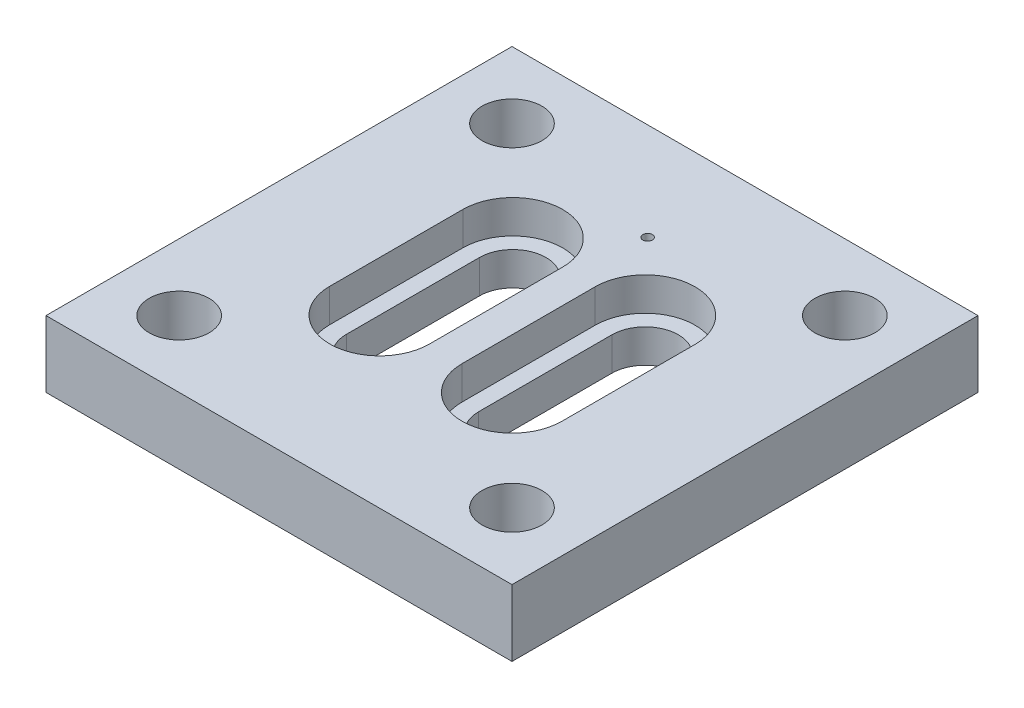
ISO-10303-21;
HEADER;
FILE_DESCRIPTION(('STEP AP214'),'2;1');
FILE_NAME('part.step','',(''),(''),'','','');
FILE_SCHEMA(('AUTOMOTIVE_DESIGN { 1 0 10303 214 1 1 1 1 }'));
ENDSEC;
DATA;
#1=APPLICATION_CONTEXT('core data for automotive mechanical design processes');
#2=APPLICATION_PROTOCOL_DEFINITION('international standard','automotive_design',2000,#1);
#3=PRODUCT_CONTEXT('',#1,'mechanical');
#4=PRODUCT('Part','Part','',(#3));
#5=PRODUCT_RELATED_PRODUCT_CATEGORY('part','',(#4));
#6=PRODUCT_DEFINITION_FORMATION('','',#4);
#7=PRODUCT_DEFINITION_CONTEXT('part definition',#1,'design');
#8=PRODUCT_DEFINITION('design','',#6,#7);
#9=PRODUCT_DEFINITION_SHAPE('','',#8);
#10=(LENGTH_UNIT() NAMED_UNIT(*) SI_UNIT(.MILLI.,.METRE.));
#11=(NAMED_UNIT(*) PLANE_ANGLE_UNIT() SI_UNIT($,.RADIAN.));
#12=(NAMED_UNIT(*) SI_UNIT($,.STERADIAN.) SOLID_ANGLE_UNIT());
#13=UNCERTAINTY_MEASURE_WITH_UNIT(LENGTH_MEASURE(1.E-05),#10,'distance_accuracy_value','');
#14=(GEOMETRIC_REPRESENTATION_CONTEXT(3) GLOBAL_UNCERTAINTY_ASSIGNED_CONTEXT((#13)) GLOBAL_UNIT_ASSIGNED_CONTEXT((#10,
#11,#12)) REPRESENTATION_CONTEXT('',''));
#15=CARTESIAN_POINT('',(0.,0.,0.));
#16=DIRECTION('',(0.,0.,1.));
#17=DIRECTION('',(1.,0.,0.));
#18=AXIS2_PLACEMENT_3D('',#15,#16,#17);
#19=CARTESIAN_POINT('',(70.,-20.,-70.));
#20=DIRECTION('',(1.,0.,0.));
#21=DIRECTION('',(0.,0.,-1.));
#22=AXIS2_PLACEMENT_3D('',#19,#20,#21);
#23=PLANE('',#22);
#24=DIRECTION('',(0.,0.,-1.));
#25=VECTOR('',#24,1.);
#26=CARTESIAN_POINT('',(70.,0.,-70.));
#27=LINE('',#26,#25);
#28=CARTESIAN_POINT('',(70.,0.,70.));
#29=VERTEX_POINT('',#28);
#30=CARTESIAN_POINT('',(70.,0.,-70.));
#31=VERTEX_POINT('',#30);
#32=EDGE_CURVE('E326',#29,#31,#27,.T.);
#33=ORIENTED_EDGE('',*,*,#32,.F.);
#34=DIRECTION('',(0.,1.,0.));
#35=VECTOR('',#34,1.);
#36=CARTESIAN_POINT('',(70.,-20.,70.));
#37=LINE('',#36,#35);
#38=CARTESIAN_POINT('',(70.,-20.,70.));
#39=VERTEX_POINT('',#38);
#40=EDGE_CURVE('E11',#39,#29,#37,.T.);
#41=ORIENTED_EDGE('',*,*,#40,.F.);
#42=DIRECTION('',(0.,0.,-1.));
#43=VECTOR('',#42,1.);
#44=CARTESIAN_POINT('',(70.,-20.,-70.));
#45=LINE('',#44,#43);
#46=CARTESIAN_POINT('',(70.,-20.,-70.));
#47=VERTEX_POINT('',#46);
#48=EDGE_CURVE('E329',#39,#47,#45,.T.);
#49=ORIENTED_EDGE('',*,*,#48,.T.);
#50=DIRECTION('',(0.,1.,0.));
#51=VECTOR('',#50,1.);
#52=CARTESIAN_POINT('',(70.,-20.,-70.));
#53=LINE('',#52,#51);
#54=EDGE_CURVE('E38',#47,#31,#53,.T.);
#55=ORIENTED_EDGE('',*,*,#54,.T.);
#56=EDGE_LOOP('',(#33,#41,#49,#55));
#57=FACE_BOUND('',#56,.T.);
#58=ADVANCED_FACE('F35',(#57),#23,.T.);
#59=CARTESIAN_POINT('',(-70.,-20.,70.));
#60=DIRECTION('',(0.,0.,1.));
#61=DIRECTION('',(1.,0.,0.));
#62=AXIS2_PLACEMENT_3D('',#59,#60,#61);
#63=PLANE('',#62);
#64=DIRECTION('',(1.,0.,0.));
#65=VECTOR('',#64,1.);
#66=CARTESIAN_POINT('',(-70.,0.,70.));
#67=LINE('',#66,#65);
#68=CARTESIAN_POINT('',(-70.,0.,70.));
#69=VERTEX_POINT('',#68);
#70=EDGE_CURVE('E333',#69,#29,#67,.T.);
#71=ORIENTED_EDGE('',*,*,#70,.F.);
#72=DIRECTION('',(0.,1.,0.));
#73=VECTOR('',#72,1.);
#74=CARTESIAN_POINT('',(-70.,-20.,70.));
#75=LINE('',#74,#73);
#76=CARTESIAN_POINT('',(-70.,-20.,70.));
#77=VERTEX_POINT('',#76);
#78=EDGE_CURVE('E43',#77,#69,#75,.T.);
#79=ORIENTED_EDGE('',*,*,#78,.F.);
#80=DIRECTION('',(1.,0.,0.));
#81=VECTOR('',#80,1.);
#82=CARTESIAN_POINT('',(-70.,-20.,70.));
#83=LINE('',#82,#81);
#84=EDGE_CURVE('E339',#77,#39,#83,.T.);
#85=ORIENTED_EDGE('',*,*,#84,.T.);
#86=ORIENTED_EDGE('',*,*,#40,.T.);
#87=EDGE_LOOP('',(#71,#79,#85,#86));
#88=FACE_BOUND('',#87,.T.);
#89=ADVANCED_FACE('F365',(#88),#63,.T.);
#90=CARTESIAN_POINT('',(-70.,-20.,-70.));
#91=DIRECTION('',(-1.,0.,0.));
#92=DIRECTION('',(0.,0.,1.));
#93=AXIS2_PLACEMENT_3D('',#90,#91,#92);
#94=PLANE('',#93);
#95=DIRECTION('',(0.,0.,1.));
#96=VECTOR('',#95,1.);
#97=CARTESIAN_POINT('',(-70.,0.,-70.));
#98=LINE('',#97,#96);
#99=CARTESIAN_POINT('',(-70.,0.,-70.));
#100=VERTEX_POINT('',#99);
#101=EDGE_CURVE('E347',#100,#69,#98,.T.);
#102=ORIENTED_EDGE('',*,*,#101,.F.);
#103=DIRECTION('',(0.,1.,0.));
#104=VECTOR('',#103,1.);
#105=CARTESIAN_POINT('',(-70.,-20.,-70.));
#106=LINE('',#105,#104);
#107=CARTESIAN_POINT('',(-70.,-20.,-70.));
#108=VERTEX_POINT('',#107);
#109=EDGE_CURVE('E352',#108,#100,#106,.T.);
#110=ORIENTED_EDGE('',*,*,#109,.F.);
#111=DIRECTION('',(0.,0.,1.));
#112=VECTOR('',#111,1.);
#113=CARTESIAN_POINT('',(-70.,-20.,-70.));
#114=LINE('',#113,#112);
#115=EDGE_CURVE('E336',#108,#77,#114,.T.);
#116=ORIENTED_EDGE('',*,*,#115,.T.);
#117=ORIENTED_EDGE('',*,*,#78,.T.);
#118=EDGE_LOOP('',(#102,#110,#116,#117));
#119=FACE_BOUND('',#118,.T.);
#120=ADVANCED_FACE('F370',(#119),#94,.T.);
#121=CARTESIAN_POINT('',(-70.,-20.,-70.));
#122=DIRECTION('',(0.,0.,-1.));
#123=DIRECTION('',(-1.,0.,0.));
#124=AXIS2_PLACEMENT_3D('',#121,#122,#123);
#125=PLANE('',#124);
#126=DIRECTION('',(-1.,0.,0.));
#127=VECTOR('',#126,1.);
#128=CARTESIAN_POINT('',(-70.,0.,-70.));
#129=LINE('',#128,#127);
#130=EDGE_CURVE('E344',#31,#100,#129,.T.);
#131=ORIENTED_EDGE('',*,*,#130,.F.);
#132=ORIENTED_EDGE('',*,*,#54,.F.);
#133=DIRECTION('',(-1.,0.,0.));
#134=VECTOR('',#133,1.);
#135=CARTESIAN_POINT('',(-70.,-20.,-70.));
#136=LINE('',#135,#134);
#137=EDGE_CURVE('E332',#47,#108,#136,.T.);
#138=ORIENTED_EDGE('',*,*,#137,.T.);
#139=ORIENTED_EDGE('',*,*,#109,.T.);
#140=EDGE_LOOP('',(#131,#132,#138,#139));
#141=FACE_BOUND('',#140,.T.);
#142=ADVANCED_FACE('F360',(#141),#125,.T.);
#143=CARTESIAN_POINT('',(0.,-20.,0.));
#144=DIRECTION('',(0.,1.,0.));
#145=DIRECTION('',(0.,0.,1.));
#146=AXIS2_PLACEMENT_3D('',#143,#144,#145);
#147=PLANE('',#146);
#148=CARTESIAN_POINT('',(0.,-20.,-40.7308031540772));
#149=DIRECTION('',(0.,1.,0.));
#150=DIRECTION('',(0.,0.,1.));
#151=AXIS2_PLACEMENT_3D('',#148,#149,#150);
#152=CIRCLE('',#151,2.3876);
#153=CARTESIAN_POINT('',(0.,-20.,-38.3432031540772));
#154=VERTEX_POINT('',#153);
#155=EDGE_CURVE('E659',#154,#154,#152,.T.);
#156=ORIENTED_EDGE('',*,*,#155,.T.);
#157=EDGE_LOOP('',(#156));
#158=FACE_BOUND('',#157,.T.);
#159=DIRECTION('',(0.,0.,1.));
#160=VECTOR('',#159,1.);
#161=CARTESIAN_POINT('',(30.,-20.,-20.));
#162=LINE('',#161,#160);
#163=CARTESIAN_POINT('',(30.,-20.,-20.));
#164=VERTEX_POINT('',#163);
#165=CARTESIAN_POINT('',(30.,-20.,20.));
#166=VERTEX_POINT('',#165);
#167=EDGE_CURVE('E189',#164,#166,#162,.T.);
#168=ORIENTED_EDGE('',*,*,#167,.F.);
#169=CARTESIAN_POINT('',(20.,-20.,-20.));
#170=DIRECTION('',(0.,-1.,0.));
#171=DIRECTION('',(0.,0.,-1.));
#172=AXIS2_PLACEMENT_3D('',#169,#170,#171);
#173=CIRCLE('',#172,10.);
#174=CARTESIAN_POINT('',(10.,-20.,-20.));
#175=VERTEX_POINT('',#174);
#176=EDGE_CURVE('E51',#175,#164,#173,.T.);
#177=ORIENTED_EDGE('',*,*,#176,.F.);
#178=DIRECTION('',(0.,0.,-1.));
#179=VECTOR('',#178,1.);
#180=CARTESIAN_POINT('',(10.,-20.,-20.));
#181=LINE('',#180,#179);
#182=CARTESIAN_POINT('',(10.,-20.,20.));
#183=VERTEX_POINT('',#182);
#184=EDGE_CURVE('E196',#183,#175,#181,.T.);
#185=ORIENTED_EDGE('',*,*,#184,.F.);
#186=CARTESIAN_POINT('',(20.,-20.,20.));
#187=DIRECTION('',(0.,-1.,0.));
#188=DIRECTION('',(0.,0.,-1.));
#189=AXIS2_PLACEMENT_3D('',#186,#187,#188);
#190=CIRCLE('',#189,10.);
#191=EDGE_CURVE('E179',#166,#183,#190,.T.);
#192=ORIENTED_EDGE('',*,*,#191,.F.);
#193=EDGE_LOOP('',(#168,#177,#185,#192));
#194=FACE_BOUND('',#193,.T.);
#195=DIRECTION('',(0.,0.,1.));
#196=VECTOR('',#195,1.);
#197=CARTESIAN_POINT('',(-10.,-20.,-20.2271705929049));
#198=LINE('',#197,#196);
#199=CARTESIAN_POINT('',(-10.,-20.,-20.2271705929049));
#200=VERTEX_POINT('',#199);
#201=CARTESIAN_POINT('',(-10.,-20.,19.7728294070951));
#202=VERTEX_POINT('',#201);
#203=EDGE_CURVE('E206',#200,#202,#198,.T.);
#204=ORIENTED_EDGE('',*,*,#203,.F.);
#205=CARTESIAN_POINT('',(-20.,-20.,-20.2271705929049));
#206=DIRECTION('',(0.,-1.,0.));
#207=DIRECTION('',(0.,0.,-1.));
#208=AXIS2_PLACEMENT_3D('',#205,#206,#207);
#209=CIRCLE('',#208,10.);
#210=CARTESIAN_POINT('',(-30.,-20.,-20.2271705929049));
#211=VERTEX_POINT('',#210);
#212=EDGE_CURVE('E59',#211,#200,#209,.T.);
#213=ORIENTED_EDGE('',*,*,#212,.F.);
#214=DIRECTION('',(0.,0.,-1.));
#215=VECTOR('',#214,1.);
#216=CARTESIAN_POINT('',(-30.,-20.,-20.2271705929049));
#217=LINE('',#216,#215);
#218=CARTESIAN_POINT('',(-30.,-20.,19.7728294070951));
#219=VERTEX_POINT('',#218);
#220=EDGE_CURVE('E213',#219,#211,#217,.T.);
#221=ORIENTED_EDGE('',*,*,#220,.F.);
#222=CARTESIAN_POINT('',(-20.,-20.,19.7728294070951));
#223=DIRECTION('',(0.,-1.,0.));
#224=DIRECTION('',(0.,0.,-1.));
#225=AXIS2_PLACEMENT_3D('',#222,#223,#224);
#226=CIRCLE('',#225,10.);
#227=EDGE_CURVE('E210',#202,#219,#226,.T.);
#228=ORIENTED_EDGE('',*,*,#227,.F.);
#229=EDGE_LOOP('',(#204,#213,#221,#228));
#230=FACE_BOUND('',#229,.T.);
#231=CARTESIAN_POINT('',(50.,-20.,50.));
#232=DIRECTION('',(0.,1.,0.));
#233=DIRECTION('',(0.,0.,1.));
#234=AXIS2_PLACEMENT_3D('',#231,#232,#233);
#235=CIRCLE('',#234,9.);
#236=CARTESIAN_POINT('',(50.,-20.,59.));
#237=VERTEX_POINT('',#236);
#238=EDGE_CURVE('E305',#237,#237,#235,.T.);
#239=ORIENTED_EDGE('',*,*,#238,.T.);
#240=EDGE_LOOP('',(#239));
#241=FACE_BOUND('',#240,.T.);
#242=CARTESIAN_POINT('',(-50.,-20.,50.));
#243=DIRECTION('',(0.,1.,0.));
#244=DIRECTION('',(0.,0.,1.));
#245=AXIS2_PLACEMENT_3D('',#242,#243,#244);
#246=CIRCLE('',#245,9.);
#247=CARTESIAN_POINT('',(-50.,-20.,59.));
#248=VERTEX_POINT('',#247);
#249=EDGE_CURVE('E311',#248,#248,#246,.T.);
#250=ORIENTED_EDGE('',*,*,#249,.T.);
#251=EDGE_LOOP('',(#250));
#252=FACE_BOUND('',#251,.T.);
#253=CARTESIAN_POINT('',(50.,-20.,-50.));
#254=DIRECTION('',(0.,1.,0.));
#255=DIRECTION('',(0.,0.,1.));
#256=AXIS2_PLACEMENT_3D('',#253,#254,#255);
#257=CIRCLE('',#256,9.);
#258=CARTESIAN_POINT('',(50.,-20.,-41.));
#259=VERTEX_POINT('',#258);
#260=EDGE_CURVE('E317',#259,#259,#257,.T.);
#261=ORIENTED_EDGE('',*,*,#260,.T.);
#262=EDGE_LOOP('',(#261));
#263=FACE_BOUND('',#262,.T.);
#264=CARTESIAN_POINT('',(-50.,-20.,-50.));
#265=DIRECTION('',(0.,1.,0.));
#266=DIRECTION('',(0.,0.,1.));
#267=AXIS2_PLACEMENT_3D('',#264,#265,#266);
#268=CIRCLE('',#267,9.);
#269=CARTESIAN_POINT('',(-50.,-20.,-41.));
#270=VERTEX_POINT('',#269);
#271=EDGE_CURVE('E323',#270,#270,#268,.T.);
#272=ORIENTED_EDGE('',*,*,#271,.T.);
#273=EDGE_LOOP('',(#272));
#274=FACE_BOUND('',#273,.T.);
#275=ORIENTED_EDGE('',*,*,#48,.F.);
#276=ORIENTED_EDGE('',*,*,#84,.F.);
#277=ORIENTED_EDGE('',*,*,#115,.F.);
#278=ORIENTED_EDGE('',*,*,#137,.F.);
#279=EDGE_LOOP('',(#275,#276,#277,#278));
#280=FACE_BOUND('',#279,.T.);
#281=ADVANCED_FACE('F193',(#158,#194,#230,#241,#252,#263,#274,#280),#147,.F.);
#282=CARTESIAN_POINT('',(0.,0.,0.));
#283=DIRECTION('',(0.,1.,0.));
#284=DIRECTION('',(0.,0.,1.));
#285=AXIS2_PLACEMENT_3D('',#282,#283,#284);
#286=PLANE('',#285);
#287=CARTESIAN_POINT('',(0.,0.,-40.7308031540772));
#288=DIRECTION('',(0.,1.,0.));
#289=DIRECTION('',(0.,0.,1.));
#290=AXIS2_PLACEMENT_3D('',#287,#288,#289);
#291=CIRCLE('',#290,1.4351);
#292=CARTESIAN_POINT('',(0.,0.,-39.2957031540772));
#293=VERTEX_POINT('',#292);
#294=EDGE_CURVE('E658',#293,#293,#291,.T.);
#295=ORIENTED_EDGE('',*,*,#294,.F.);
#296=EDGE_LOOP('',(#295));
#297=FACE_BOUND('',#296,.T.);
#298=CARTESIAN_POINT('',(-20.,0.,19.7728294070951));
#299=DIRECTION('',(0.,1.,0.));
#300=DIRECTION('',(0.,0.,1.));
#301=AXIS2_PLACEMENT_3D('',#298,#299,#300);
#302=CIRCLE('',#301,15.);
#303=CARTESIAN_POINT('',(-35.,0.,19.7728294070951));
#304=VERTEX_POINT('',#303);
#305=CARTESIAN_POINT('',(-5.00000000000001,0.,19.7728294070951));
#306=VERTEX_POINT('',#305);
#307=EDGE_CURVE('E234',#304,#306,#302,.T.);
#308=ORIENTED_EDGE('',*,*,#307,.F.);
#309=DIRECTION('',(0.,0.,1.));
#310=VECTOR('',#309,1.);
#311=CARTESIAN_POINT('',(-35.,0.,-20.2271705929049));
#312=LINE('',#311,#310);
#313=CARTESIAN_POINT('',(-35.,0.,-20.2271705929049));
#314=VERTEX_POINT('',#313);
#315=EDGE_CURVE('E239',#314,#304,#312,.T.);
#316=ORIENTED_EDGE('',*,*,#315,.F.);
#317=CARTESIAN_POINT('',(-20.,0.,-20.2271705929049));
#318=DIRECTION('',(0.,1.,0.));
#319=DIRECTION('',(0.,0.,1.));
#320=AXIS2_PLACEMENT_3D('',#317,#318,#319);
#321=CIRCLE('',#320,15.);
#322=CARTESIAN_POINT('',(-5.,0.,-20.2271705929049));
#323=VERTEX_POINT('',#322);
#324=EDGE_CURVE('E253',#323,#314,#321,.T.);
#325=ORIENTED_EDGE('',*,*,#324,.F.);
#326=DIRECTION('',(0.,0.,-1.));
#327=VECTOR('',#326,1.);
#328=CARTESIAN_POINT('',(-5.00000000000001,0.,-20.2271705929049));
#329=LINE('',#328,#327);
#330=EDGE_CURVE('E250',#306,#323,#329,.T.);
#331=ORIENTED_EDGE('',*,*,#330,.F.);
#332=EDGE_LOOP('',(#308,#316,#325,#331));
#333=FACE_BOUND('',#332,.T.);
#334=CARTESIAN_POINT('',(20.,0.,20.));
#335=DIRECTION('',(0.,1.,0.));
#336=DIRECTION('',(0.,0.,1.));
#337=AXIS2_PLACEMENT_3D('',#334,#335,#336);
#338=CIRCLE('',#337,15.);
#339=CARTESIAN_POINT('',(5.,0.,20.));
#340=VERTEX_POINT('',#339);
#341=CARTESIAN_POINT('',(35.,0.,20.));
#342=VERTEX_POINT('',#341);
#343=EDGE_CURVE('E274',#340,#342,#338,.T.);
#344=ORIENTED_EDGE('',*,*,#343,.F.);
#345=DIRECTION('',(0.,0.,1.));
#346=VECTOR('',#345,1.);
#347=CARTESIAN_POINT('',(5.,0.,-20.));
#348=LINE('',#347,#346);
#349=CARTESIAN_POINT('',(5.,0.,-20.));
#350=VERTEX_POINT('',#349);
#351=EDGE_CURVE('E279',#350,#340,#348,.T.);
#352=ORIENTED_EDGE('',*,*,#351,.F.);
#353=CARTESIAN_POINT('',(20.,0.,-20.));
#354=DIRECTION('',(0.,1.,0.));
#355=DIRECTION('',(0.,0.,1.));
#356=AXIS2_PLACEMENT_3D('',#353,#354,#355);
#357=CIRCLE('',#356,15.);
#358=CARTESIAN_POINT('',(35.,0.,-20.));
#359=VERTEX_POINT('',#358);
#360=EDGE_CURVE('E293',#359,#350,#357,.T.);
#361=ORIENTED_EDGE('',*,*,#360,.F.);
#362=DIRECTION('',(0.,0.,-1.));
#363=VECTOR('',#362,1.);
#364=CARTESIAN_POINT('',(35.,0.,-20.));
#365=LINE('',#364,#363);
#366=EDGE_CURVE('E290',#342,#359,#365,.T.);
#367=ORIENTED_EDGE('',*,*,#366,.F.);
#368=EDGE_LOOP('',(#344,#352,#361,#367));
#369=FACE_BOUND('',#368,.T.);
#370=CARTESIAN_POINT('',(50.,0.,50.));
#371=DIRECTION('',(0.,1.,0.));
#372=DIRECTION('',(0.,0.,1.));
#373=AXIS2_PLACEMENT_3D('',#370,#371,#372);
#374=CIRCLE('',#373,9.);
#375=CARTESIAN_POINT('',(50.,0.,59.));
#376=VERTEX_POINT('',#375);
#377=EDGE_CURVE('E260',#376,#376,#374,.T.);
#378=ORIENTED_EDGE('',*,*,#377,.F.);
#379=EDGE_LOOP('',(#378));
#380=FACE_BOUND('',#379,.T.);
#381=CARTESIAN_POINT('',(-50.,0.,50.));
#382=DIRECTION('',(0.,1.,0.));
#383=DIRECTION('',(0.,0.,1.));
#384=AXIS2_PLACEMENT_3D('',#381,#382,#383);
#385=CIRCLE('',#384,9.);
#386=CARTESIAN_POINT('',(-50.,0.,59.));
#387=VERTEX_POINT('',#386);
#388=EDGE_CURVE('E308',#387,#387,#385,.T.);
#389=ORIENTED_EDGE('',*,*,#388,.F.);
#390=EDGE_LOOP('',(#389));
#391=FACE_BOUND('',#390,.T.);
#392=CARTESIAN_POINT('',(50.,0.,-50.));
#393=DIRECTION('',(0.,1.,0.));
#394=DIRECTION('',(0.,0.,1.));
#395=AXIS2_PLACEMENT_3D('',#392,#393,#394);
#396=CIRCLE('',#395,9.);
#397=CARTESIAN_POINT('',(50.,0.,-41.));
#398=VERTEX_POINT('',#397);
#399=EDGE_CURVE('E314',#398,#398,#396,.T.);
#400=ORIENTED_EDGE('',*,*,#399,.F.);
#401=EDGE_LOOP('',(#400));
#402=FACE_BOUND('',#401,.T.);
#403=CARTESIAN_POINT('',(-50.,0.,-50.));
#404=DIRECTION('',(0.,1.,0.));
#405=DIRECTION('',(0.,0.,1.));
#406=AXIS2_PLACEMENT_3D('',#403,#404,#405);
#407=CIRCLE('',#406,9.);
#408=CARTESIAN_POINT('',(-50.,0.,-41.));
#409=VERTEX_POINT('',#408);
#410=EDGE_CURVE('E320',#409,#409,#407,.T.);
#411=ORIENTED_EDGE('',*,*,#410,.F.);
#412=EDGE_LOOP('',(#411));
#413=FACE_BOUND('',#412,.T.);
#414=ORIENTED_EDGE('',*,*,#32,.T.);
#415=ORIENTED_EDGE('',*,*,#130,.T.);
#416=ORIENTED_EDGE('',*,*,#101,.T.);
#417=ORIENTED_EDGE('',*,*,#70,.T.);
#418=EDGE_LOOP('',(#414,#415,#416,#417));
#419=FACE_BOUND('',#418,.T.);
#420=ADVANCED_FACE('F362',(#297,#333,#369,#380,#391,#402,#413,#419),#286,.T.);
#421=CARTESIAN_POINT('',(-50.,-20.,-50.));
#422=DIRECTION('',(0.,1.,0.));
#423=DIRECTION('',(0.,0.,1.));
#424=AXIS2_PLACEMENT_3D('',#421,#422,#423);
#425=CYLINDRICAL_SURFACE('',#424,9.);
#426=ORIENTED_EDGE('',*,*,#271,.F.);
#427=EDGE_LOOP('',(#426));
#428=FACE_BOUND('',#427,.T.);
#429=ORIENTED_EDGE('',*,*,#410,.T.);
#430=EDGE_LOOP('',(#429));
#431=FACE_BOUND('',#430,.T.);
#432=ADVANCED_FACE('F402',(#428,#431),#425,.F.);
#433=CARTESIAN_POINT('',(50.,-20.,-50.));
#434=DIRECTION('',(0.,1.,0.));
#435=DIRECTION('',(0.,0.,1.));
#436=AXIS2_PLACEMENT_3D('',#433,#434,#435);
#437=CYLINDRICAL_SURFACE('',#436,9.);
#438=ORIENTED_EDGE('',*,*,#260,.F.);
#439=EDGE_LOOP('',(#438));
#440=FACE_BOUND('',#439,.T.);
#441=ORIENTED_EDGE('',*,*,#399,.T.);
#442=EDGE_LOOP('',(#441));
#443=FACE_BOUND('',#442,.T.);
#444=ADVANCED_FACE('F407',(#440,#443),#437,.F.);
#445=CARTESIAN_POINT('',(-50.,-20.,50.));
#446=DIRECTION('',(0.,1.,0.));
#447=DIRECTION('',(0.,0.,1.));
#448=AXIS2_PLACEMENT_3D('',#445,#446,#447);
#449=CYLINDRICAL_SURFACE('',#448,9.);
#450=ORIENTED_EDGE('',*,*,#249,.F.);
#451=EDGE_LOOP('',(#450));
#452=FACE_BOUND('',#451,.T.);
#453=ORIENTED_EDGE('',*,*,#388,.T.);
#454=EDGE_LOOP('',(#453));
#455=FACE_BOUND('',#454,.T.);
#456=ADVANCED_FACE('F419',(#452,#455),#449,.F.);
#457=CARTESIAN_POINT('',(50.,-20.,50.));
#458=DIRECTION('',(0.,1.,0.));
#459=DIRECTION('',(0.,0.,1.));
#460=AXIS2_PLACEMENT_3D('',#457,#458,#459);
#461=CYLINDRICAL_SURFACE('',#460,9.);
#462=ORIENTED_EDGE('',*,*,#238,.F.);
#463=EDGE_LOOP('',(#462));
#464=FACE_BOUND('',#463,.T.);
#465=ORIENTED_EDGE('',*,*,#377,.T.);
#466=EDGE_LOOP('',(#465));
#467=FACE_BOUND('',#466,.T.);
#468=ADVANCED_FACE('F429',(#464,#467),#461,.F.);
#469=CARTESIAN_POINT('',(20.,-10.,20.));
#470=DIRECTION('',(0.,1.,0.));
#471=DIRECTION('',(0.,0.,1.));
#472=AXIS2_PLACEMENT_3D('',#469,#470,#471);
#473=CYLINDRICAL_SURFACE('',#472,15.);
#474=ORIENTED_EDGE('',*,*,#343,.T.);
#475=DIRECTION('',(0.,1.,0.));
#476=VECTOR('',#475,1.);
#477=CARTESIAN_POINT('',(35.,-10.,20.));
#478=LINE('',#477,#476);
#479=CARTESIAN_POINT('',(35.,-10.,20.));
#480=VERTEX_POINT('',#479);
#481=EDGE_CURVE('E288',#480,#342,#478,.T.);
#482=ORIENTED_EDGE('',*,*,#481,.F.);
#483=CARTESIAN_POINT('',(20.,-10.,20.));
#484=DIRECTION('',(0.,1.,0.));
#485=DIRECTION('',(0.,0.,1.));
#486=AXIS2_PLACEMENT_3D('',#483,#484,#485);
#487=CIRCLE('',#486,15.);
#488=CARTESIAN_POINT('',(5.,-10.,20.));
#489=VERTEX_POINT('',#488);
#490=EDGE_CURVE('E275',#489,#480,#487,.T.);
#491=ORIENTED_EDGE('',*,*,#490,.F.);
#492=DIRECTION('',(0.,1.,0.));
#493=VECTOR('',#492,1.);
#494=CARTESIAN_POINT('',(5.,-10.,20.));
#495=LINE('',#494,#493);
#496=EDGE_CURVE('E228',#489,#340,#495,.T.);
#497=ORIENTED_EDGE('',*,*,#496,.T.);
#498=EDGE_LOOP('',(#474,#482,#491,#497));
#499=FACE_BOUND('',#498,.T.);
#500=ADVANCED_FACE('F439',(#499),#473,.F.);
#501=CARTESIAN_POINT('',(5.,-10.,-20.));
#502=DIRECTION('',(-1.,0.,0.));
#503=DIRECTION('',(0.,0.,1.));
#504=AXIS2_PLACEMENT_3D('',#501,#502,#503);
#505=PLANE('',#504);
#506=ORIENTED_EDGE('',*,*,#351,.T.);
#507=ORIENTED_EDGE('',*,*,#496,.F.);
#508=DIRECTION('',(0.,0.,1.));
#509=VECTOR('',#508,1.);
#510=CARTESIAN_POINT('',(5.,-10.,-20.));
#511=LINE('',#510,#509);
#512=CARTESIAN_POINT('',(5.,-10.,-20.));
#513=VERTEX_POINT('',#512);
#514=EDGE_CURVE('E285',#513,#489,#511,.T.);
#515=ORIENTED_EDGE('',*,*,#514,.F.);
#516=DIRECTION('',(0.,1.,0.));
#517=VECTOR('',#516,1.);
#518=CARTESIAN_POINT('',(5.,-10.,-20.));
#519=LINE('',#518,#517);
#520=EDGE_CURVE('E299',#513,#350,#519,.T.);
#521=ORIENTED_EDGE('',*,*,#520,.T.);
#522=EDGE_LOOP('',(#506,#507,#515,#521));
#523=FACE_BOUND('',#522,.T.);
#524=ADVANCED_FACE('F449',(#523),#505,.F.);
#525=CARTESIAN_POINT('',(20.,-10.,-20.));
#526=DIRECTION('',(0.,1.,0.));
#527=DIRECTION('',(0.,0.,1.));
#528=AXIS2_PLACEMENT_3D('',#525,#526,#527);
#529=CYLINDRICAL_SURFACE('',#528,15.);
#530=ORIENTED_EDGE('',*,*,#360,.T.);
#531=ORIENTED_EDGE('',*,*,#520,.F.);
#532=CARTESIAN_POINT('',(20.,-10.,-20.));
#533=DIRECTION('',(0.,1.,0.));
#534=DIRECTION('',(0.,0.,1.));
#535=AXIS2_PLACEMENT_3D('',#532,#533,#534);
#536=CIRCLE('',#535,15.);
#537=CARTESIAN_POINT('',(35.,-10.,-20.));
#538=VERTEX_POINT('',#537);
#539=EDGE_CURVE('E282',#538,#513,#536,.T.);
#540=ORIENTED_EDGE('',*,*,#539,.F.);
#541=DIRECTION('',(0.,1.,0.));
#542=VECTOR('',#541,1.);
#543=CARTESIAN_POINT('',(35.,-10.,-20.));
#544=LINE('',#543,#542);
#545=EDGE_CURVE('E301',#538,#359,#544,.T.);
#546=ORIENTED_EDGE('',*,*,#545,.T.);
#547=EDGE_LOOP('',(#530,#531,#540,#546));
#548=FACE_BOUND('',#547,.T.);
#549=ADVANCED_FACE('F459',(#548),#529,.F.);
#550=CARTESIAN_POINT('',(35.,-10.,-20.));
#551=DIRECTION('',(1.,0.,0.));
#552=DIRECTION('',(0.,0.,-1.));
#553=AXIS2_PLACEMENT_3D('',#550,#551,#552);
#554=PLANE('',#553);
#555=ORIENTED_EDGE('',*,*,#366,.T.);
#556=ORIENTED_EDGE('',*,*,#545,.F.);
#557=DIRECTION('',(0.,0.,-1.));
#558=VECTOR('',#557,1.);
#559=CARTESIAN_POINT('',(35.,-10.,-20.));
#560=LINE('',#559,#558);
#561=EDGE_CURVE('E278',#480,#538,#560,.T.);
#562=ORIENTED_EDGE('',*,*,#561,.F.);
#563=ORIENTED_EDGE('',*,*,#481,.T.);
#564=EDGE_LOOP('',(#555,#556,#562,#563));
#565=FACE_BOUND('',#564,.T.);
#566=ADVANCED_FACE('F469',(#565),#554,.F.);
#567=CARTESIAN_POINT('',(20.,-10.,20.));
#568=DIRECTION('',(0.,1.,0.));
#569=DIRECTION('',(0.,0.,1.));
#570=AXIS2_PLACEMENT_3D('',#567,#568,#569);
#571=PLANE('',#570);
#572=DIRECTION('',(0.,0.,1.));
#573=VECTOR('',#572,1.);
#574=CARTESIAN_POINT('',(10.,-10.,-20.));
#575=LINE('',#574,#573);
#576=CARTESIAN_POINT('',(10.,-10.,-20.));
#577=VERTEX_POINT('',#576);
#578=CARTESIAN_POINT('',(10.,-10.,20.));
#579=VERTEX_POINT('',#578);
#580=EDGE_CURVE('E272',#577,#579,#575,.T.);
#581=ORIENTED_EDGE('',*,*,#580,.F.);
#582=CARTESIAN_POINT('',(20.,-10.,-20.));
#583=DIRECTION('',(0.,1.,0.));
#584=DIRECTION('',(0.,0.,1.));
#585=AXIS2_PLACEMENT_3D('',#582,#583,#584);
#586=CIRCLE('',#585,10.);
#587=CARTESIAN_POINT('',(30.,-10.,-20.));
#588=VERTEX_POINT('',#587);
#589=EDGE_CURVE('E270',#588,#577,#586,.T.);
#590=ORIENTED_EDGE('',*,*,#589,.F.);
#591=DIRECTION('',(0.,0.,-1.));
#592=VECTOR('',#591,1.);
#593=CARTESIAN_POINT('',(30.,-10.,-20.));
#594=LINE('',#593,#592);
#595=CARTESIAN_POINT('',(30.,-10.,20.));
#596=VERTEX_POINT('',#595);
#597=EDGE_CURVE('E268',#596,#588,#594,.T.);
#598=ORIENTED_EDGE('',*,*,#597,.F.);
#599=CARTESIAN_POINT('',(20.,-10.,20.));
#600=DIRECTION('',(0.,1.,0.));
#601=DIRECTION('',(0.,0.,1.));
#602=AXIS2_PLACEMENT_3D('',#599,#600,#601);
#603=CIRCLE('',#602,9.99999999999999);
#604=EDGE_CURVE('E182',#579,#596,#603,.T.);
#605=ORIENTED_EDGE('',*,*,#604,.F.);
#606=EDGE_LOOP('',(#581,#590,#598,#605));
#607=FACE_BOUND('',#606,.T.);
#608=ORIENTED_EDGE('',*,*,#490,.T.);
#609=ORIENTED_EDGE('',*,*,#561,.T.);
#610=ORIENTED_EDGE('',*,*,#539,.T.);
#611=ORIENTED_EDGE('',*,*,#514,.T.);
#612=EDGE_LOOP('',(#608,#609,#610,#611));
#613=FACE_BOUND('',#612,.T.);
#614=ADVANCED_FACE('F479',(#607,#613),#571,.T.);
#615=CARTESIAN_POINT('',(-20.,-10.,19.7728294070951));
#616=DIRECTION('',(0.,1.,0.));
#617=DIRECTION('',(0.,0.,1.));
#618=AXIS2_PLACEMENT_3D('',#615,#616,#617);
#619=CYLINDRICAL_SURFACE('',#618,15.);
#620=ORIENTED_EDGE('',*,*,#307,.T.);
#621=DIRECTION('',(0.,1.,0.));
#622=VECTOR('',#621,1.);
#623=CARTESIAN_POINT('',(-5.00000000000001,-10.,19.7728294070951));
#624=LINE('',#623,#622);
#625=CARTESIAN_POINT('',(-5.00000000000001,-10.,19.7728294070951));
#626=VERTEX_POINT('',#625);
#627=EDGE_CURVE('E248',#626,#306,#624,.T.);
#628=ORIENTED_EDGE('',*,*,#627,.F.);
#629=CARTESIAN_POINT('',(-20.,-10.,19.7728294070951));
#630=DIRECTION('',(0.,1.,0.));
#631=DIRECTION('',(0.,0.,1.));
#632=AXIS2_PLACEMENT_3D('',#629,#630,#631);
#633=CIRCLE('',#632,15.);
#634=CARTESIAN_POINT('',(-35.,-10.,19.7728294070951));
#635=VERTEX_POINT('',#634);
#636=EDGE_CURVE('E235',#635,#626,#633,.T.);
#637=ORIENTED_EDGE('',*,*,#636,.F.);
#638=DIRECTION('',(0.,1.,0.));
#639=VECTOR('',#638,1.);
#640=CARTESIAN_POINT('',(-35.,-10.,19.7728294070951));
#641=LINE('',#640,#639);
#642=EDGE_CURVE('E258',#635,#304,#641,.T.);
#643=ORIENTED_EDGE('',*,*,#642,.T.);
#644=EDGE_LOOP('',(#620,#628,#637,#643));
#645=FACE_BOUND('',#644,.T.);
#646=ADVANCED_FACE('F487',(#645),#619,.F.);
#647=CARTESIAN_POINT('',(-35.,-10.,-20.2271705929049));
#648=DIRECTION('',(-1.,0.,0.));
#649=DIRECTION('',(0.,0.,1.));
#650=AXIS2_PLACEMENT_3D('',#647,#648,#649);
#651=PLANE('',#650);
#652=ORIENTED_EDGE('',*,*,#315,.T.);
#653=ORIENTED_EDGE('',*,*,#642,.F.);
#654=DIRECTION('',(0.,0.,1.));
#655=VECTOR('',#654,1.);
#656=CARTESIAN_POINT('',(-35.,-10.,-20.2271705929049));
#657=LINE('',#656,#655);
#658=CARTESIAN_POINT('',(-35.,-10.,-20.2271705929049));
#659=VERTEX_POINT('',#658);
#660=EDGE_CURVE('E245',#659,#635,#657,.T.);
#661=ORIENTED_EDGE('',*,*,#660,.F.);
#662=DIRECTION('',(0.,1.,0.));
#663=VECTOR('',#662,1.);
#664=CARTESIAN_POINT('',(-35.,-10.,-20.2271705929049));
#665=LINE('',#664,#663);
#666=EDGE_CURVE('E261',#659,#314,#665,.T.);
#667=ORIENTED_EDGE('',*,*,#666,.T.);
#668=EDGE_LOOP('',(#652,#653,#661,#667));
#669=FACE_BOUND('',#668,.T.);
#670=ADVANCED_FACE('F492',(#669),#651,.F.);
#671=CARTESIAN_POINT('',(-20.,-10.,-20.2271705929049));
#672=DIRECTION('',(0.,1.,0.));
#673=DIRECTION('',(0.,0.,1.));
#674=AXIS2_PLACEMENT_3D('',#671,#672,#673);
#675=CYLINDRICAL_SURFACE('',#674,15.);
#676=ORIENTED_EDGE('',*,*,#324,.T.);
#677=ORIENTED_EDGE('',*,*,#666,.F.);
#678=CARTESIAN_POINT('',(-20.,-10.,-20.2271705929049));
#679=DIRECTION('',(0.,1.,0.));
#680=DIRECTION('',(0.,0.,1.));
#681=AXIS2_PLACEMENT_3D('',#678,#679,#680);
#682=CIRCLE('',#681,15.);
#683=CARTESIAN_POINT('',(-5.,-10.,-20.2271705929049));
#684=VERTEX_POINT('',#683);
#685=EDGE_CURVE('E242',#684,#659,#682,.T.);
#686=ORIENTED_EDGE('',*,*,#685,.F.);
#687=DIRECTION('',(0.,1.,0.));
#688=VECTOR('',#687,1.);
#689=CARTESIAN_POINT('',(-5.,-10.,-20.2271705929049));
#690=LINE('',#689,#688);
#691=EDGE_CURVE('E263',#684,#323,#690,.T.);
#692=ORIENTED_EDGE('',*,*,#691,.T.);
#693=EDGE_LOOP('',(#676,#677,#686,#692));
#694=FACE_BOUND('',#693,.T.);
#695=ADVANCED_FACE('F502',(#694),#675,.F.);
#696=CARTESIAN_POINT('',(-5.00000000000001,-10.,-20.2271705929049));
#697=DIRECTION('',(1.,0.,0.));
#698=DIRECTION('',(0.,0.,-1.));
#699=AXIS2_PLACEMENT_3D('',#696,#697,#698);
#700=PLANE('',#699);
#701=ORIENTED_EDGE('',*,*,#330,.T.);
#702=ORIENTED_EDGE('',*,*,#691,.F.);
#703=DIRECTION('',(0.,0.,-1.));
#704=VECTOR('',#703,1.);
#705=CARTESIAN_POINT('',(-5.00000000000001,-10.,-20.2271705929049));
#706=LINE('',#705,#704);
#707=EDGE_CURVE('E238',#626,#684,#706,.T.);
#708=ORIENTED_EDGE('',*,*,#707,.F.);
#709=ORIENTED_EDGE('',*,*,#627,.T.);
#710=EDGE_LOOP('',(#701,#702,#708,#709));
#711=FACE_BOUND('',#710,.T.);
#712=ADVANCED_FACE('F512',(#711),#700,.F.);
#713=CARTESIAN_POINT('',(-20.,-10.,19.7728294070951));
#714=DIRECTION('',(0.,1.,0.));
#715=DIRECTION('',(0.,0.,1.));
#716=AXIS2_PLACEMENT_3D('',#713,#714,#715);
#717=PLANE('',#716);
#718=DIRECTION('',(0.,0.,1.));
#719=VECTOR('',#718,1.);
#720=CARTESIAN_POINT('',(-30.,-10.,-20.2271705929049));
#721=LINE('',#720,#719);
#722=CARTESIAN_POINT('',(-30.,-10.,-20.2271705929049));
#723=VERTEX_POINT('',#722);
#724=CARTESIAN_POINT('',(-30.,-10.,19.7728294070951));
#725=VERTEX_POINT('',#724);
#726=EDGE_CURVE('E232',#723,#725,#721,.T.);
#727=ORIENTED_EDGE('',*,*,#726,.F.);
#728=CARTESIAN_POINT('',(-20.,-10.,-20.2271705929049));
#729=DIRECTION('',(0.,1.,0.));
#730=DIRECTION('',(0.,0.,1.));
#731=AXIS2_PLACEMENT_3D('',#728,#729,#730);
#732=CIRCLE('',#731,10.);
#733=CARTESIAN_POINT('',(-10.,-10.,-20.2271705929049));
#734=VERTEX_POINT('',#733);
#735=EDGE_CURVE('E230',#734,#723,#732,.T.);
#736=ORIENTED_EDGE('',*,*,#735,.F.);
#737=DIRECTION('',(0.,0.,-1.));
#738=VECTOR('',#737,1.);
#739=CARTESIAN_POINT('',(-10.,-10.,-20.2271705929049));
#740=LINE('',#739,#738);
#741=CARTESIAN_POINT('',(-10.,-10.,19.7728294070951));
#742=VERTEX_POINT('',#741);
#743=EDGE_CURVE('E227',#742,#734,#740,.T.);
#744=ORIENTED_EDGE('',*,*,#743,.F.);
#745=CARTESIAN_POINT('',(-20.,-10.,19.7728294070951));
#746=DIRECTION('',(0.,1.,0.));
#747=DIRECTION('',(0.,0.,1.));
#748=AXIS2_PLACEMENT_3D('',#745,#746,#747);
#749=CIRCLE('',#748,10.);
#750=EDGE_CURVE('E224',#725,#742,#749,.T.);
#751=ORIENTED_EDGE('',*,*,#750,.F.);
#752=EDGE_LOOP('',(#727,#736,#744,#751));
#753=FACE_BOUND('',#752,.T.);
#754=ORIENTED_EDGE('',*,*,#636,.T.);
#755=ORIENTED_EDGE('',*,*,#707,.T.);
#756=ORIENTED_EDGE('',*,*,#685,.T.);
#757=ORIENTED_EDGE('',*,*,#660,.T.);
#758=EDGE_LOOP('',(#754,#755,#756,#757));
#759=FACE_BOUND('',#758,.T.);
#760=ADVANCED_FACE('F522',(#753,#759),#717,.T.);
#761=CARTESIAN_POINT('',(-20.,0.,-20.2271705929049));
#762=DIRECTION('',(0.,-1.,0.));
#763=DIRECTION('',(0.,0.,-1.));
#764=AXIS2_PLACEMENT_3D('',#761,#762,#763);
#765=CYLINDRICAL_SURFACE('',#764,10.);
#766=ORIENTED_EDGE('',*,*,#735,.T.);
#767=DIRECTION('',(0.,-1.,0.));
#768=VECTOR('',#767,1.);
#769=CARTESIAN_POINT('',(-30.,0.,-20.2271705929049));
#770=LINE('',#769,#768);
#771=EDGE_CURVE('E217',#723,#211,#770,.T.);
#772=ORIENTED_EDGE('',*,*,#771,.T.);
#773=ORIENTED_EDGE('',*,*,#212,.T.);
#774=DIRECTION('',(0.,-1.,0.));
#775=VECTOR('',#774,1.);
#776=CARTESIAN_POINT('',(-10.,0.,-20.2271705929049));
#777=LINE('',#776,#775);
#778=EDGE_CURVE('E216',#734,#200,#777,.T.);
#779=ORIENTED_EDGE('',*,*,#778,.F.);
#780=EDGE_LOOP('',(#766,#772,#773,#779));
#781=FACE_BOUND('',#780,.T.);
#782=ADVANCED_FACE('F539',(#781),#765,.F.);
#783=CARTESIAN_POINT('',(-30.,0.,-20.2271705929049));
#784=DIRECTION('',(-1.,0.,0.));
#785=DIRECTION('',(0.,0.,1.));
#786=AXIS2_PLACEMENT_3D('',#783,#784,#785);
#787=PLANE('',#786);
#788=ORIENTED_EDGE('',*,*,#726,.T.);
#789=DIRECTION('',(0.,-1.,0.));
#790=VECTOR('',#789,1.);
#791=CARTESIAN_POINT('',(-30.,0.,19.7728294070951));
#792=LINE('',#791,#790);
#793=EDGE_CURVE('E219',#725,#219,#792,.T.);
#794=ORIENTED_EDGE('',*,*,#793,.T.);
#795=ORIENTED_EDGE('',*,*,#220,.T.);
#796=ORIENTED_EDGE('',*,*,#771,.F.);
#797=EDGE_LOOP('',(#788,#794,#795,#796));
#798=FACE_BOUND('',#797,.T.);
#799=ADVANCED_FACE('F549',(#798),#787,.F.);
#800=CARTESIAN_POINT('',(-20.,0.,19.7728294070951));
#801=DIRECTION('',(0.,-1.,0.));
#802=DIRECTION('',(0.,0.,-1.));
#803=AXIS2_PLACEMENT_3D('',#800,#801,#802);
#804=CYLINDRICAL_SURFACE('',#803,10.);
#805=ORIENTED_EDGE('',*,*,#750,.T.);
#806=DIRECTION('',(0.,-1.,0.));
#807=VECTOR('',#806,1.);
#808=CARTESIAN_POINT('',(-10.,0.,19.7728294070951));
#809=LINE('',#808,#807);
#810=EDGE_CURVE('E221',#742,#202,#809,.T.);
#811=ORIENTED_EDGE('',*,*,#810,.T.);
#812=ORIENTED_EDGE('',*,*,#227,.T.);
#813=ORIENTED_EDGE('',*,*,#793,.F.);
#814=EDGE_LOOP('',(#805,#811,#812,#813));
#815=FACE_BOUND('',#814,.T.);
#816=ADVANCED_FACE('F558',(#815),#804,.F.);
#817=CARTESIAN_POINT('',(-10.,0.,-20.2271705929049));
#818=DIRECTION('',(1.,0.,0.));
#819=DIRECTION('',(0.,0.,-1.));
#820=AXIS2_PLACEMENT_3D('',#817,#818,#819);
#821=PLANE('',#820);
#822=ORIENTED_EDGE('',*,*,#743,.T.);
#823=ORIENTED_EDGE('',*,*,#778,.T.);
#824=ORIENTED_EDGE('',*,*,#203,.T.);
#825=ORIENTED_EDGE('',*,*,#810,.F.);
#826=EDGE_LOOP('',(#822,#823,#824,#825));
#827=FACE_BOUND('',#826,.T.);
#828=ADVANCED_FACE('F568',(#827),#821,.F.);
#829=CARTESIAN_POINT('',(20.,0.,-20.));
#830=DIRECTION('',(0.,-1.,0.));
#831=DIRECTION('',(0.,0.,-1.));
#832=AXIS2_PLACEMENT_3D('',#829,#830,#831);
#833=CYLINDRICAL_SURFACE('',#832,10.);
#834=ORIENTED_EDGE('',*,*,#589,.T.);
#835=DIRECTION('',(0.,-1.,0.));
#836=VECTOR('',#835,1.);
#837=CARTESIAN_POINT('',(10.,0.,-20.));
#838=LINE('',#837,#836);
#839=EDGE_CURVE('E201',#577,#175,#838,.T.);
#840=ORIENTED_EDGE('',*,*,#839,.T.);
#841=ORIENTED_EDGE('',*,*,#176,.T.);
#842=DIRECTION('',(0.,-1.,0.));
#843=VECTOR('',#842,1.);
#844=CARTESIAN_POINT('',(30.,0.,-20.));
#845=LINE('',#844,#843);
#846=EDGE_CURVE('E186',#588,#164,#845,.T.);
#847=ORIENTED_EDGE('',*,*,#846,.F.);
#848=EDGE_LOOP('',(#834,#840,#841,#847));
#849=FACE_BOUND('',#848,.T.);
#850=ADVANCED_FACE('F578',(#849),#833,.F.);
#851=CARTESIAN_POINT('',(10.,0.,-20.));
#852=DIRECTION('',(-1.,0.,0.));
#853=DIRECTION('',(0.,0.,1.));
#854=AXIS2_PLACEMENT_3D('',#851,#852,#853);
#855=PLANE('',#854);
#856=ORIENTED_EDGE('',*,*,#580,.T.);
#857=DIRECTION('',(0.,-1.,0.));
#858=VECTOR('',#857,1.);
#859=CARTESIAN_POINT('',(10.,0.,20.));
#860=LINE('',#859,#858);
#861=EDGE_CURVE('E185',#579,#183,#860,.T.);
#862=ORIENTED_EDGE('',*,*,#861,.T.);
#863=ORIENTED_EDGE('',*,*,#184,.T.);
#864=ORIENTED_EDGE('',*,*,#839,.F.);
#865=EDGE_LOOP('',(#856,#862,#863,#864));
#866=FACE_BOUND('',#865,.T.);
#867=ADVANCED_FACE('F588',(#866),#855,.F.);
#868=CARTESIAN_POINT('',(20.,0.,20.));
#869=DIRECTION('',(0.,-1.,0.));
#870=DIRECTION('',(0.,0.,-1.));
#871=AXIS2_PLACEMENT_3D('',#868,#869,#870);
#872=CYLINDRICAL_SURFACE('',#871,10.);
#873=ORIENTED_EDGE('',*,*,#604,.T.);
#874=DIRECTION('',(0.,-1.,0.));
#875=VECTOR('',#874,1.);
#876=CARTESIAN_POINT('',(30.,0.,20.));
#877=LINE('',#876,#875);
#878=EDGE_CURVE('E174',#596,#166,#877,.T.);
#879=ORIENTED_EDGE('',*,*,#878,.T.);
#880=ORIENTED_EDGE('',*,*,#191,.T.);
#881=ORIENTED_EDGE('',*,*,#861,.F.);
#882=EDGE_LOOP('',(#873,#879,#880,#881));
#883=FACE_BOUND('',#882,.T.);
#884=ADVANCED_FACE('F176',(#883),#872,.F.);
#885=CARTESIAN_POINT('',(30.,0.,-20.));
#886=DIRECTION('',(1.,0.,0.));
#887=DIRECTION('',(0.,0.,-1.));
#888=AXIS2_PLACEMENT_3D('',#885,#886,#887);
#889=PLANE('',#888);
#890=ORIENTED_EDGE('',*,*,#597,.T.);
#891=ORIENTED_EDGE('',*,*,#846,.T.);
#892=ORIENTED_EDGE('',*,*,#167,.T.);
#893=ORIENTED_EDGE('',*,*,#878,.F.);
#894=EDGE_LOOP('',(#890,#891,#892,#893));
#895=FACE_BOUND('',#894,.T.);
#896=ADVANCED_FACE('F190',(#895),#889,.F.);
#897=CARTESIAN_POINT('',(0.,-19.0475,-40.7308031540772));
#898=DIRECTION('',(0.,-1.,0.));
#899=DIRECTION('',(0.,0.,-1.));
#900=AXIS2_PLACEMENT_3D('',#897,#898,#899);
#901=CONICAL_SURFACE('',#900,1.4351,0.785398163397447);
#902=ORIENTED_EDGE('',*,*,#155,.F.);
#903=EDGE_LOOP('',(#902));
#904=FACE_BOUND('',#903,.T.);
#905=CARTESIAN_POINT('',(0.,-19.0475,-40.7308031540772));
#906=DIRECTION('',(0.,1.,0.));
#907=DIRECTION('',(0.,0.,1.));
#908=AXIS2_PLACEMENT_3D('',#905,#906,#907);
#909=CIRCLE('',#908,1.4351);
#910=CARTESIAN_POINT('',(0.,-19.0475,-39.2957031540772));
#911=VERTEX_POINT('',#910);
#912=EDGE_CURVE('E207',#911,#911,#909,.T.);
#913=ORIENTED_EDGE('',*,*,#912,.T.);
#914=EDGE_LOOP('',(#913));
#915=FACE_BOUND('',#914,.T.);
#916=ADVANCED_FACE('F614',(#904,#915),#901,.F.);
#917=CARTESIAN_POINT('',(0.,0.,-40.7308031540772));
#918=DIRECTION('',(0.,1.,0.));
#919=DIRECTION('',(0.,0.,1.));
#920=AXIS2_PLACEMENT_3D('',#917,#918,#919);
#921=CYLINDRICAL_SURFACE('',#920,1.4351);
#922=ORIENTED_EDGE('',*,*,#912,.F.);
#923=EDGE_LOOP('',(#922));
#924=FACE_BOUND('',#923,.T.);
#925=ORIENTED_EDGE('',*,*,#294,.T.);
#926=EDGE_LOOP('',(#925));
#927=FACE_BOUND('',#926,.T.);
#928=ADVANCED_FACE('F637',(#924,#927),#921,.F.);
#929=CLOSED_SHELL('',(#58,#89,#120,#142,#281,#420,#432,#444,#456,#468,#500,#524,#549,#566,#614,
#646,#670,#695,#712,#760,#782,#799,#816,#828,#850,#867,#884,#896,#916,#928));
#930=MANIFOLD_SOLID_BREP('B2',#929);
#931=ADVANCED_BREP_SHAPE_REPRESENTATION('',(#18,#930),#14);
#932=SHAPE_DEFINITION_REPRESENTATION(#9,#931);
ENDSEC;
END-ISO-10303-21;
